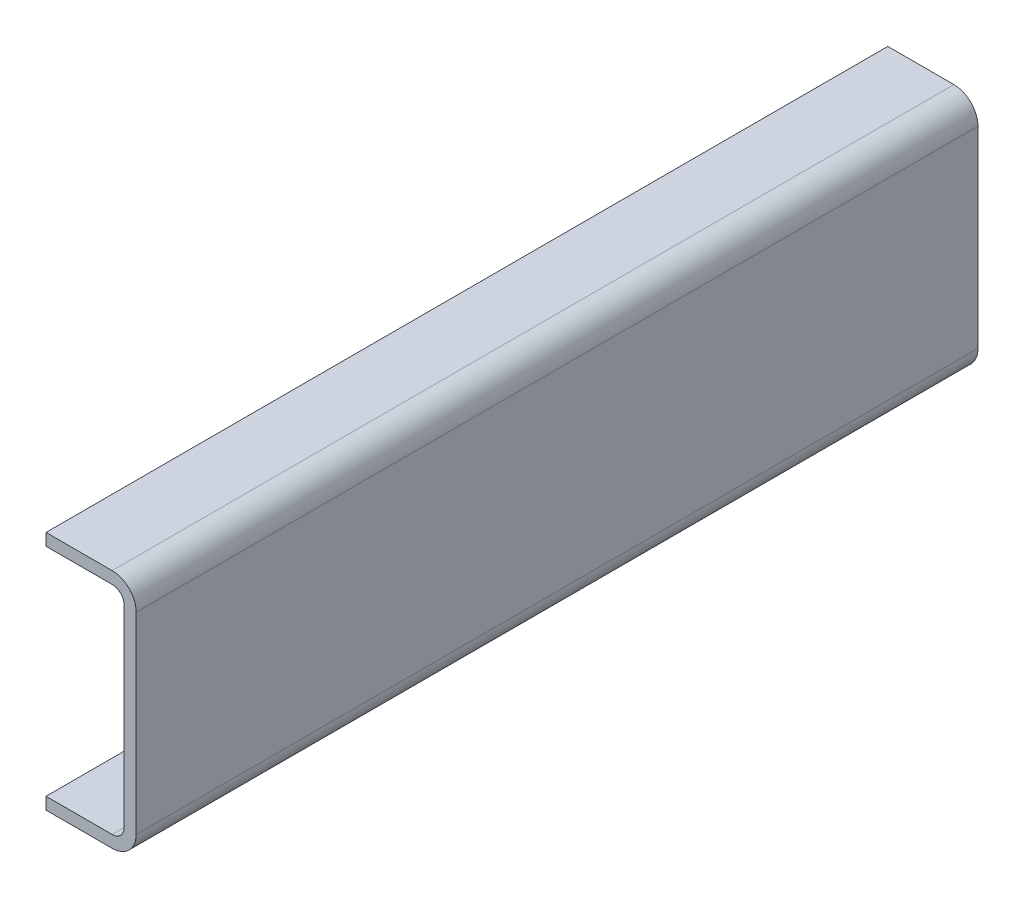
ISO-10303-21;
HEADER;
FILE_DESCRIPTION(('STEP AP214'),'2;1');
FILE_NAME('part.step','',(''),(''),'','','');
FILE_SCHEMA(('AUTOMOTIVE_DESIGN { 1 0 10303 214 1 1 1 1 }'));
ENDSEC;
DATA;
#1=APPLICATION_CONTEXT('core data for automotive mechanical design processes');
#2=APPLICATION_PROTOCOL_DEFINITION('international standard','automotive_design',2000,#1);
#3=PRODUCT_CONTEXT('',#1,'mechanical');
#4=PRODUCT('Part','Part','',(#3));
#5=PRODUCT_RELATED_PRODUCT_CATEGORY('part','',(#4));
#6=PRODUCT_DEFINITION_FORMATION('','',#4);
#7=PRODUCT_DEFINITION_CONTEXT('part definition',#1,'design');
#8=PRODUCT_DEFINITION('design','',#6,#7);
#9=PRODUCT_DEFINITION_SHAPE('','',#8);
#10=(LENGTH_UNIT() NAMED_UNIT(*) SI_UNIT(.MILLI.,.METRE.));
#11=(NAMED_UNIT(*) PLANE_ANGLE_UNIT() SI_UNIT($,.RADIAN.));
#12=(NAMED_UNIT(*) SI_UNIT($,.STERADIAN.) SOLID_ANGLE_UNIT());
#13=UNCERTAINTY_MEASURE_WITH_UNIT(LENGTH_MEASURE(1.E-05),#10,'distance_accuracy_value','');
#14=(GEOMETRIC_REPRESENTATION_CONTEXT(3) GLOBAL_UNCERTAINTY_ASSIGNED_CONTEXT((#13)) GLOBAL_UNIT_ASSIGNED_CONTEXT((#10,
#11,#12)) REPRESENTATION_CONTEXT('',''));
#15=CARTESIAN_POINT('',(0.,0.,0.));
#16=DIRECTION('',(0.,0.,1.));
#17=DIRECTION('',(1.,0.,0.));
#18=AXIS2_PLACEMENT_3D('',#15,#16,#17);
#19=CARTESIAN_POINT('',(-2.54,2.54,88.9));
#20=DIRECTION('',(0.,0.,-1.));
#21=DIRECTION('',(-1.,0.,0.));
#22=AXIS2_PLACEMENT_3D('',#19,#20,#21);
#23=CYLINDRICAL_SURFACE('',#22,2.54);
#24=CARTESIAN_POINT('',(-2.54,2.54,0.));
#25=DIRECTION('',(0.,0.,1.));
#26=DIRECTION('',(-1.,0.,0.));
#27=AXIS2_PLACEMENT_3D('',#24,#25,#26);
#28=CIRCLE('',#27,2.54);
#29=CARTESIAN_POINT('',(-2.54000000000002,0.,0.));
#30=VERTEX_POINT('',#29);
#31=CARTESIAN_POINT('',(0.,2.54000000000002,0.));
#32=VERTEX_POINT('',#31);
#33=EDGE_CURVE('E153',#30,#32,#28,.T.);
#34=ORIENTED_EDGE('',*,*,#33,.T.);
#35=DIRECTION('',(0.,0.,-1.));
#36=VECTOR('',#35,1.);
#37=CARTESIAN_POINT('',(0.,2.54000000000002,88.9));
#38=LINE('',#37,#36);
#39=CARTESIAN_POINT('',(0.,2.54000000000002,88.9));
#40=VERTEX_POINT('',#39);
#41=EDGE_CURVE('E11',#40,#32,#38,.T.);
#42=ORIENTED_EDGE('',*,*,#41,.F.);
#43=CARTESIAN_POINT('',(-2.54,2.54,88.9));
#44=DIRECTION('',(0.,0.,1.));
#45=DIRECTION('',(-1.,0.,0.));
#46=AXIS2_PLACEMENT_3D('',#43,#44,#45);
#47=CIRCLE('',#46,2.54);
#48=CARTESIAN_POINT('',(-2.54000000000002,0.,88.9));
#49=VERTEX_POINT('',#48);
#50=EDGE_CURVE('E175',#49,#40,#47,.T.);
#51=ORIENTED_EDGE('',*,*,#50,.F.);
#52=DIRECTION('',(0.,0.,-1.));
#53=VECTOR('',#52,1.);
#54=CARTESIAN_POINT('',(-2.54000000000002,0.,88.9));
#55=LINE('',#54,#53);
#56=EDGE_CURVE('E149',#49,#30,#55,.T.);
#57=ORIENTED_EDGE('',*,*,#56,.T.);
#58=EDGE_LOOP('',(#34,#42,#51,#57));
#59=FACE_BOUND('',#58,.T.);
#60=ADVANCED_FACE('F33',(#59),#23,.T.);
#61=CARTESIAN_POINT('',(0.,2.54000000000002,88.9));
#62=DIRECTION('',(-1.,0.,0.));
#63=DIRECTION('',(0.,0.,1.));
#64=AXIS2_PLACEMENT_3D('',#61,#62,#63);
#65=PLANE('',#64);
#66=DIRECTION('',(0.,1.,0.));
#67=VECTOR('',#66,1.);
#68=CARTESIAN_POINT('',(0.,2.54000000000002,0.));
#69=LINE('',#68,#67);
#70=CARTESIAN_POINT('',(0.,22.86,0.));
#71=VERTEX_POINT('',#70);
#72=EDGE_CURVE('E156',#32,#71,#69,.T.);
#73=ORIENTED_EDGE('',*,*,#72,.T.);
#74=DIRECTION('',(0.,0.,-1.));
#75=VECTOR('',#74,1.);
#76=CARTESIAN_POINT('',(0.,22.86,88.9));
#77=LINE('',#76,#75);
#78=CARTESIAN_POINT('',(0.,22.86,88.9));
#79=VERTEX_POINT('',#78);
#80=EDGE_CURVE('E41',#79,#71,#77,.T.);
#81=ORIENTED_EDGE('',*,*,#80,.F.);
#82=DIRECTION('',(0.,1.,0.));
#83=VECTOR('',#82,1.);
#84=CARTESIAN_POINT('',(0.,2.54000000000002,88.9));
#85=LINE('',#84,#83);
#86=EDGE_CURVE('E104',#40,#79,#85,.T.);
#87=ORIENTED_EDGE('',*,*,#86,.F.);
#88=ORIENTED_EDGE('',*,*,#41,.T.);
#89=EDGE_LOOP('',(#73,#81,#87,#88));
#90=FACE_BOUND('',#89,.T.);
#91=ADVANCED_FACE('F253',(#90),#65,.F.);
#92=CARTESIAN_POINT('',(-2.54,22.86,88.9));
#93=DIRECTION('',(0.,0.,-1.));
#94=DIRECTION('',(-1.,0.,0.));
#95=AXIS2_PLACEMENT_3D('',#92,#93,#94);
#96=CYLINDRICAL_SURFACE('',#95,2.54);
#97=CARTESIAN_POINT('',(-2.54,22.86,0.));
#98=DIRECTION('',(0.,0.,1.));
#99=DIRECTION('',(1.,0.,0.));
#100=AXIS2_PLACEMENT_3D('',#97,#98,#99);
#101=CIRCLE('',#100,2.54);
#102=CARTESIAN_POINT('',(-2.54000000000002,25.4,0.));
#103=VERTEX_POINT('',#102);
#104=EDGE_CURVE('E158',#71,#103,#101,.T.);
#105=ORIENTED_EDGE('',*,*,#104,.T.);
#106=DIRECTION('',(0.,0.,-1.));
#107=VECTOR('',#106,1.);
#108=CARTESIAN_POINT('',(-2.54000000000002,25.4,88.9));
#109=LINE('',#108,#107);
#110=CARTESIAN_POINT('',(-2.54000000000002,25.4,88.9));
#111=VERTEX_POINT('',#110);
#112=EDGE_CURVE('E194',#111,#103,#109,.T.);
#113=ORIENTED_EDGE('',*,*,#112,.F.);
#114=CARTESIAN_POINT('',(-2.54,22.86,88.9));
#115=DIRECTION('',(0.,0.,1.));
#116=DIRECTION('',(1.,0.,0.));
#117=AXIS2_PLACEMENT_3D('',#114,#115,#116);
#118=CIRCLE('',#117,2.54);
#119=EDGE_CURVE('E202',#79,#111,#118,.T.);
#120=ORIENTED_EDGE('',*,*,#119,.F.);
#121=ORIENTED_EDGE('',*,*,#80,.T.);
#122=EDGE_LOOP('',(#105,#113,#120,#121));
#123=FACE_BOUND('',#122,.T.);
#124=ADVANCED_FACE('F200',(#123),#96,.T.);
#125=CARTESIAN_POINT('',(-2.54000000000002,25.4,88.9));
#126=DIRECTION('',(0.,-1.,0.));
#127=DIRECTION('',(0.,0.,-1.));
#128=AXIS2_PLACEMENT_3D('',#125,#126,#127);
#129=PLANE('',#128);
#130=DIRECTION('',(-1.,0.,0.));
#131=VECTOR('',#130,1.);
#132=CARTESIAN_POINT('',(-2.54000000000002,25.4,0.));
#133=LINE('',#132,#131);
#134=CARTESIAN_POINT('',(-9.525,25.4,0.));
#135=VERTEX_POINT('',#134);
#136=EDGE_CURVE('E160',#103,#135,#133,.T.);
#137=ORIENTED_EDGE('',*,*,#136,.T.);
#138=DIRECTION('',(0.,0.,-1.));
#139=VECTOR('',#138,1.);
#140=CARTESIAN_POINT('',(-9.525,25.4,88.9));
#141=LINE('',#140,#139);
#142=CARTESIAN_POINT('',(-9.525,25.4,88.9));
#143=VERTEX_POINT('',#142);
#144=EDGE_CURVE('E191',#143,#135,#141,.T.);
#145=ORIENTED_EDGE('',*,*,#144,.F.);
#146=DIRECTION('',(-1.,0.,0.));
#147=VECTOR('',#146,1.);
#148=CARTESIAN_POINT('',(-2.54000000000002,25.4,88.9));
#149=LINE('',#148,#147);
#150=EDGE_CURVE('E220',#111,#143,#149,.T.);
#151=ORIENTED_EDGE('',*,*,#150,.F.);
#152=ORIENTED_EDGE('',*,*,#112,.T.);
#153=EDGE_LOOP('',(#137,#145,#151,#152));
#154=FACE_BOUND('',#153,.T.);
#155=ADVANCED_FACE('F211',(#154),#129,.F.);
#156=CARTESIAN_POINT('',(-9.525,25.4,88.9));
#157=DIRECTION('',(1.,0.,0.));
#158=DIRECTION('',(0.,0.,-1.));
#159=AXIS2_PLACEMENT_3D('',#156,#157,#158);
#160=PLANE('',#159);
#161=DIRECTION('',(0.,-1.,0.));
#162=VECTOR('',#161,1.);
#163=CARTESIAN_POINT('',(-9.525,25.4,0.));
#164=LINE('',#163,#162);
#165=CARTESIAN_POINT('',(-9.525,24.13,0.));
#166=VERTEX_POINT('',#165);
#167=EDGE_CURVE('E162',#135,#166,#164,.T.);
#168=ORIENTED_EDGE('',*,*,#167,.T.);
#169=DIRECTION('',(0.,0.,-1.));
#170=VECTOR('',#169,1.);
#171=CARTESIAN_POINT('',(-9.525,24.13,88.9));
#172=LINE('',#171,#170);
#173=CARTESIAN_POINT('',(-9.525,24.13,88.9));
#174=VERTEX_POINT('',#173);
#175=EDGE_CURVE('E188',#174,#166,#172,.T.);
#176=ORIENTED_EDGE('',*,*,#175,.F.);
#177=DIRECTION('',(0.,-1.,0.));
#178=VECTOR('',#177,1.);
#179=CARTESIAN_POINT('',(-9.525,25.4,88.9));
#180=LINE('',#179,#178);
#181=EDGE_CURVE('E217',#143,#174,#180,.T.);
#182=ORIENTED_EDGE('',*,*,#181,.F.);
#183=ORIENTED_EDGE('',*,*,#144,.T.);
#184=EDGE_LOOP('',(#168,#176,#182,#183));
#185=FACE_BOUND('',#184,.T.);
#186=ADVANCED_FACE('F215',(#185),#160,.F.);
#187=CARTESIAN_POINT('',(-2.54000000000001,24.13,88.9));
#188=DIRECTION('',(0.,1.,0.));
#189=DIRECTION('',(0.,0.,1.));
#190=AXIS2_PLACEMENT_3D('',#187,#188,#189);
#191=PLANE('',#190);
#192=DIRECTION('',(1.,0.,0.));
#193=VECTOR('',#192,1.);
#194=CARTESIAN_POINT('',(-2.54000000000001,24.13,0.));
#195=LINE('',#194,#193);
#196=CARTESIAN_POINT('',(-2.54000000000001,24.13,0.));
#197=VERTEX_POINT('',#196);
#198=EDGE_CURVE('E164',#166,#197,#195,.T.);
#199=ORIENTED_EDGE('',*,*,#198,.T.);
#200=DIRECTION('',(0.,0.,-1.));
#201=VECTOR('',#200,1.);
#202=CARTESIAN_POINT('',(-2.54000000000001,24.13,88.9));
#203=LINE('',#202,#201);
#204=CARTESIAN_POINT('',(-2.54000000000001,24.13,88.9));
#205=VERTEX_POINT('',#204);
#206=EDGE_CURVE('E185',#205,#197,#203,.T.);
#207=ORIENTED_EDGE('',*,*,#206,.F.);
#208=DIRECTION('',(1.,0.,0.));
#209=VECTOR('',#208,1.);
#210=CARTESIAN_POINT('',(-2.54000000000001,24.13,88.9));
#211=LINE('',#210,#209);
#212=EDGE_CURVE('E219',#174,#205,#211,.T.);
#213=ORIENTED_EDGE('',*,*,#212,.F.);
#214=ORIENTED_EDGE('',*,*,#175,.T.);
#215=EDGE_LOOP('',(#199,#207,#213,#214));
#216=FACE_BOUND('',#215,.T.);
#217=ADVANCED_FACE('F266',(#216),#191,.F.);
#218=CARTESIAN_POINT('',(-2.54,22.86,88.9));
#219=DIRECTION('',(0.,0.,-1.));
#220=DIRECTION('',(-1.,0.,0.));
#221=AXIS2_PLACEMENT_3D('',#218,#219,#220);
#222=CYLINDRICAL_SURFACE('',#221,1.27);
#223=CARTESIAN_POINT('',(-2.54,22.86,0.));
#224=DIRECTION('',(0.,0.,-1.));
#225=DIRECTION('',(1.,0.,0.));
#226=AXIS2_PLACEMENT_3D('',#223,#224,#225);
#227=CIRCLE('',#226,1.27);
#228=CARTESIAN_POINT('',(-1.27,22.86,0.));
#229=VERTEX_POINT('',#228);
#230=EDGE_CURVE('E166',#197,#229,#227,.T.);
#231=ORIENTED_EDGE('',*,*,#230,.T.);
#232=DIRECTION('',(0.,0.,-1.));
#233=VECTOR('',#232,1.);
#234=CARTESIAN_POINT('',(-1.27,22.86,88.9));
#235=LINE('',#234,#233);
#236=CARTESIAN_POINT('',(-1.27,22.86,88.9));
#237=VERTEX_POINT('',#236);
#238=EDGE_CURVE('E182',#237,#229,#235,.T.);
#239=ORIENTED_EDGE('',*,*,#238,.F.);
#240=CARTESIAN_POINT('',(-2.54,22.86,88.9));
#241=DIRECTION('',(0.,0.,-1.));
#242=DIRECTION('',(1.,0.,0.));
#243=AXIS2_PLACEMENT_3D('',#240,#241,#242);
#244=CIRCLE('',#243,1.27);
#245=EDGE_CURVE('E222',#205,#237,#244,.T.);
#246=ORIENTED_EDGE('',*,*,#245,.F.);
#247=ORIENTED_EDGE('',*,*,#206,.T.);
#248=EDGE_LOOP('',(#231,#239,#246,#247));
#249=FACE_BOUND('',#248,.T.);
#250=ADVANCED_FACE('F269',(#249),#222,.F.);
#251=CARTESIAN_POINT('',(-1.27,2.54000000000001,88.9));
#252=DIRECTION('',(1.,0.,0.));
#253=DIRECTION('',(0.,1.,0.));
#254=AXIS2_PLACEMENT_3D('',#251,#252,#253);
#255=PLANE('',#254);
#256=DIRECTION('',(0.,-1.,0.));
#257=VECTOR('',#256,1.);
#258=CARTESIAN_POINT('',(-1.27,2.54000000000001,0.));
#259=LINE('',#258,#257);
#260=CARTESIAN_POINT('',(-1.27,2.54000000000001,0.));
#261=VERTEX_POINT('',#260);
#262=EDGE_CURVE('E168',#229,#261,#259,.T.);
#263=ORIENTED_EDGE('',*,*,#262,.T.);
#264=DIRECTION('',(0.,0.,-1.));
#265=VECTOR('',#264,1.);
#266=CARTESIAN_POINT('',(-1.27,2.54000000000001,88.9));
#267=LINE('',#266,#265);
#268=CARTESIAN_POINT('',(-1.27,2.54000000000001,88.9));
#269=VERTEX_POINT('',#268);
#270=EDGE_CURVE('E179',#269,#261,#267,.T.);
#271=ORIENTED_EDGE('',*,*,#270,.F.);
#272=DIRECTION('',(0.,-1.,0.));
#273=VECTOR('',#272,1.);
#274=CARTESIAN_POINT('',(-1.27,2.54000000000001,88.9));
#275=LINE('',#274,#273);
#276=EDGE_CURVE('E228',#237,#269,#275,.T.);
#277=ORIENTED_EDGE('',*,*,#276,.F.);
#278=ORIENTED_EDGE('',*,*,#238,.T.);
#279=EDGE_LOOP('',(#263,#271,#277,#278));
#280=FACE_BOUND('',#279,.T.);
#281=ADVANCED_FACE('F234',(#280),#255,.F.);
#282=CARTESIAN_POINT('',(-2.54,2.54,88.9));
#283=DIRECTION('',(0.,0.,-1.));
#284=DIRECTION('',(-1.,0.,0.));
#285=AXIS2_PLACEMENT_3D('',#282,#283,#284);
#286=CYLINDRICAL_SURFACE('',#285,1.27);
#287=CARTESIAN_POINT('',(-2.54,2.54,0.));
#288=DIRECTION('',(0.,0.,-1.));
#289=DIRECTION('',(-1.,0.,0.));
#290=AXIS2_PLACEMENT_3D('',#287,#288,#289);
#291=CIRCLE('',#290,1.27);
#292=CARTESIAN_POINT('',(-2.54000000000002,1.27,0.));
#293=VERTEX_POINT('',#292);
#294=EDGE_CURVE('E170',#261,#293,#291,.T.);
#295=ORIENTED_EDGE('',*,*,#294,.T.);
#296=DIRECTION('',(0.,0.,-1.));
#297=VECTOR('',#296,1.);
#298=CARTESIAN_POINT('',(-2.54000000000002,1.27,88.9));
#299=LINE('',#298,#297);
#300=CARTESIAN_POINT('',(-2.54000000000002,1.27,88.9));
#301=VERTEX_POINT('',#300);
#302=EDGE_CURVE('E144',#301,#293,#299,.T.);
#303=ORIENTED_EDGE('',*,*,#302,.F.);
#304=CARTESIAN_POINT('',(-2.54,2.54,88.9));
#305=DIRECTION('',(0.,0.,-1.));
#306=DIRECTION('',(-1.,0.,0.));
#307=AXIS2_PLACEMENT_3D('',#304,#305,#306);
#308=CIRCLE('',#307,1.27);
#309=EDGE_CURVE('E135',#269,#301,#308,.T.);
#310=ORIENTED_EDGE('',*,*,#309,.F.);
#311=ORIENTED_EDGE('',*,*,#270,.T.);
#312=EDGE_LOOP('',(#295,#303,#310,#311));
#313=FACE_BOUND('',#312,.T.);
#314=ADVANCED_FACE('F238',(#313),#286,.F.);
#315=CARTESIAN_POINT('',(-2.54000000000002,1.27,88.9));
#316=DIRECTION('',(0.,-1.,0.));
#317=DIRECTION('',(0.,0.,-1.));
#318=AXIS2_PLACEMENT_3D('',#315,#316,#317);
#319=PLANE('',#318);
#320=DIRECTION('',(-1.,0.,0.));
#321=VECTOR('',#320,1.);
#322=CARTESIAN_POINT('',(-2.54000000000002,1.27,0.));
#323=LINE('',#322,#321);
#324=CARTESIAN_POINT('',(-9.525,1.27,0.));
#325=VERTEX_POINT('',#324);
#326=EDGE_CURVE('E143',#293,#325,#323,.T.);
#327=ORIENTED_EDGE('',*,*,#326,.T.);
#328=DIRECTION('',(0.,0.,-1.));
#329=VECTOR('',#328,1.);
#330=CARTESIAN_POINT('',(-9.525,1.27,88.9));
#331=LINE('',#330,#329);
#332=CARTESIAN_POINT('',(-9.525,1.27,88.9));
#333=VERTEX_POINT('',#332);
#334=EDGE_CURVE('E140',#333,#325,#331,.T.);
#335=ORIENTED_EDGE('',*,*,#334,.F.);
#336=DIRECTION('',(-1.,0.,0.));
#337=VECTOR('',#336,1.);
#338=CARTESIAN_POINT('',(-2.54000000000002,1.27,88.9));
#339=LINE('',#338,#337);
#340=EDGE_CURVE('E129',#301,#333,#339,.T.);
#341=ORIENTED_EDGE('',*,*,#340,.F.);
#342=ORIENTED_EDGE('',*,*,#302,.T.);
#343=EDGE_LOOP('',(#327,#335,#341,#342));
#344=FACE_BOUND('',#343,.T.);
#345=ADVANCED_FACE('F141',(#344),#319,.F.);
#346=CARTESIAN_POINT('',(-9.525,1.27,88.9));
#347=DIRECTION('',(1.,0.,0.));
#348=DIRECTION('',(0.,0.,-1.));
#349=AXIS2_PLACEMENT_3D('',#346,#347,#348);
#350=PLANE('',#349);
#351=DIRECTION('',(0.,-1.,0.));
#352=VECTOR('',#351,1.);
#353=CARTESIAN_POINT('',(-9.525,1.27,0.));
#354=LINE('',#353,#352);
#355=CARTESIAN_POINT('',(-9.525,0.,0.));
#356=VERTEX_POINT('',#355);
#357=EDGE_CURVE('E90',#325,#356,#354,.T.);
#358=ORIENTED_EDGE('',*,*,#357,.T.);
#359=DIRECTION('',(0.,0.,-1.));
#360=VECTOR('',#359,1.);
#361=CARTESIAN_POINT('',(-9.525,0.,88.9));
#362=LINE('',#361,#360);
#363=CARTESIAN_POINT('',(-9.525,0.,88.9));
#364=VERTEX_POINT('',#363);
#365=EDGE_CURVE('E145',#364,#356,#362,.T.);
#366=ORIENTED_EDGE('',*,*,#365,.F.);
#367=DIRECTION('',(0.,-1.,0.));
#368=VECTOR('',#367,1.);
#369=CARTESIAN_POINT('',(-9.525,1.27,88.9));
#370=LINE('',#369,#368);
#371=EDGE_CURVE('E133',#333,#364,#370,.T.);
#372=ORIENTED_EDGE('',*,*,#371,.F.);
#373=ORIENTED_EDGE('',*,*,#334,.T.);
#374=EDGE_LOOP('',(#358,#366,#372,#373));
#375=FACE_BOUND('',#374,.T.);
#376=ADVANCED_FACE('F147',(#375),#350,.F.);
#377=CARTESIAN_POINT('',(-2.54000000000002,0.,88.9));
#378=DIRECTION('',(0.,1.,0.));
#379=DIRECTION('',(0.,0.,1.));
#380=AXIS2_PLACEMENT_3D('',#377,#378,#379);
#381=PLANE('',#380);
#382=DIRECTION('',(1.,0.,0.));
#383=VECTOR('',#382,1.);
#384=CARTESIAN_POINT('',(-2.54000000000002,0.,0.));
#385=LINE('',#384,#383);
#386=EDGE_CURVE('E96',#356,#30,#385,.T.);
#387=ORIENTED_EDGE('',*,*,#386,.T.);
#388=ORIENTED_EDGE('',*,*,#56,.F.);
#389=DIRECTION('',(1.,0.,0.));
#390=VECTOR('',#389,1.);
#391=CARTESIAN_POINT('',(-2.54000000000002,0.,88.9));
#392=LINE('',#391,#390);
#393=EDGE_CURVE('E49',#364,#49,#392,.T.);
#394=ORIENTED_EDGE('',*,*,#393,.F.);
#395=ORIENTED_EDGE('',*,*,#365,.T.);
#396=EDGE_LOOP('',(#387,#388,#394,#395));
#397=FACE_BOUND('',#396,.T.);
#398=ADVANCED_FACE('F242',(#397),#381,.F.);
#399=CARTESIAN_POINT('',(-2.54,2.54,88.9));
#400=DIRECTION('',(0.,0.,-1.));
#401=DIRECTION('',(-1.,0.,0.));
#402=AXIS2_PLACEMENT_3D('',#399,#400,#401);
#403=PLANE('',#402);
#404=ORIENTED_EDGE('',*,*,#50,.T.);
#405=ORIENTED_EDGE('',*,*,#86,.T.);
#406=ORIENTED_EDGE('',*,*,#119,.T.);
#407=ORIENTED_EDGE('',*,*,#150,.T.);
#408=ORIENTED_EDGE('',*,*,#181,.T.);
#409=ORIENTED_EDGE('',*,*,#212,.T.);
#410=ORIENTED_EDGE('',*,*,#245,.T.);
#411=ORIENTED_EDGE('',*,*,#276,.T.);
#412=ORIENTED_EDGE('',*,*,#309,.T.);
#413=ORIENTED_EDGE('',*,*,#340,.T.);
#414=ORIENTED_EDGE('',*,*,#371,.T.);
#415=ORIENTED_EDGE('',*,*,#393,.T.);
#416=EDGE_LOOP('',(#404,#405,#406,#407,#408,#409,#410,#411,#412,#413,#414,#415));
#417=FACE_BOUND('',#416,.T.);
#418=ADVANCED_FACE('F131',(#417),#403,.F.);
#419=CARTESIAN_POINT('',(-2.54,2.54,0.));
#420=DIRECTION('',(0.,0.,-1.));
#421=DIRECTION('',(-1.,0.,0.));
#422=AXIS2_PLACEMENT_3D('',#419,#420,#421);
#423=PLANE('',#422);
#424=ORIENTED_EDGE('',*,*,#33,.F.);
#425=ORIENTED_EDGE('',*,*,#386,.F.);
#426=ORIENTED_EDGE('',*,*,#357,.F.);
#427=ORIENTED_EDGE('',*,*,#326,.F.);
#428=ORIENTED_EDGE('',*,*,#294,.F.);
#429=ORIENTED_EDGE('',*,*,#262,.F.);
#430=ORIENTED_EDGE('',*,*,#230,.F.);
#431=ORIENTED_EDGE('',*,*,#198,.F.);
#432=ORIENTED_EDGE('',*,*,#167,.F.);
#433=ORIENTED_EDGE('',*,*,#136,.F.);
#434=ORIENTED_EDGE('',*,*,#104,.F.);
#435=ORIENTED_EDGE('',*,*,#72,.F.);
#436=EDGE_LOOP('',(#424,#425,#426,#427,#428,#429,#430,#431,#432,#433,#434,#435));
#437=FACE_BOUND('',#436,.T.);
#438=ADVANCED_FACE('F206',(#437),#423,.T.);
#439=CLOSED_SHELL('',(#60,#91,#124,#155,#186,#217,#250,#281,#314,#345,#376,#398,#418,#438));
#440=MANIFOLD_SOLID_BREP('B2',#439);
#441=ADVANCED_BREP_SHAPE_REPRESENTATION('',(#18,#440),#14);
#442=SHAPE_DEFINITION_REPRESENTATION(#9,#441);
ENDSEC;
END-ISO-10303-21;
